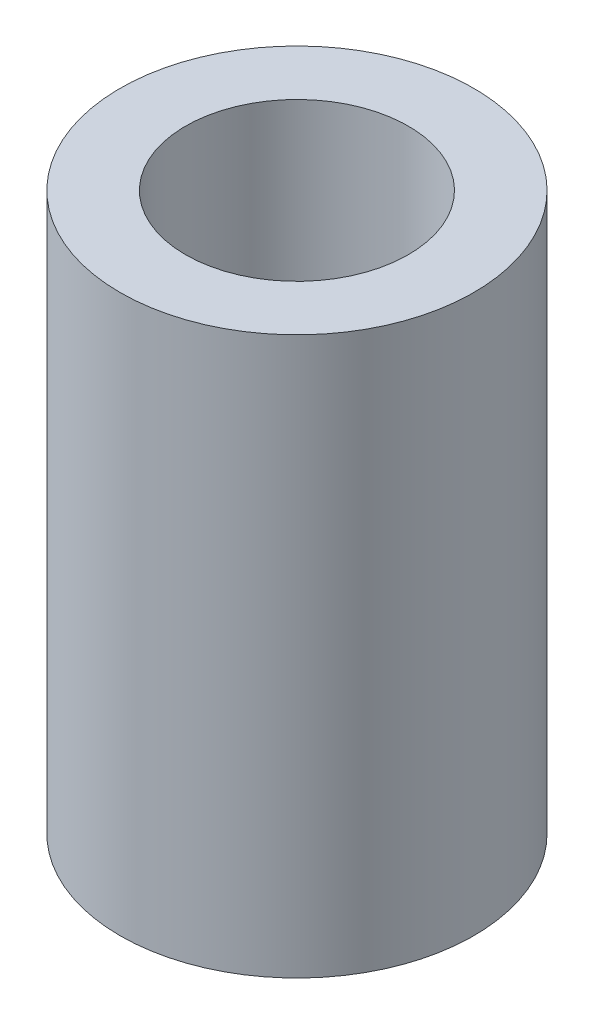
ISO-10303-21;
HEADER;
FILE_DESCRIPTION(('STEP AP214'),'2;1');
FILE_NAME('part.step','',(''),(''),'','','');
FILE_SCHEMA(('AUTOMOTIVE_DESIGN { 1 0 10303 214 1 1 1 1 }'));
ENDSEC;
DATA;
#1=APPLICATION_CONTEXT('core data for automotive mechanical design processes');
#2=APPLICATION_PROTOCOL_DEFINITION('international standard','automotive_design',2000,#1);
#3=PRODUCT_CONTEXT('',#1,'mechanical');
#4=PRODUCT('Part','Part','',(#3));
#5=PRODUCT_RELATED_PRODUCT_CATEGORY('part','',(#4));
#6=PRODUCT_DEFINITION_FORMATION('','',#4);
#7=PRODUCT_DEFINITION_CONTEXT('part definition',#1,'design');
#8=PRODUCT_DEFINITION('design','',#6,#7);
#9=PRODUCT_DEFINITION_SHAPE('','',#8);
#10=(LENGTH_UNIT() NAMED_UNIT(*) SI_UNIT(.MILLI.,.METRE.));
#11=(NAMED_UNIT(*) PLANE_ANGLE_UNIT() SI_UNIT($,.RADIAN.));
#12=(NAMED_UNIT(*) SI_UNIT($,.STERADIAN.) SOLID_ANGLE_UNIT());
#13=UNCERTAINTY_MEASURE_WITH_UNIT(LENGTH_MEASURE(1.E-05),#10,'distance_accuracy_value','');
#14=(GEOMETRIC_REPRESENTATION_CONTEXT(3) GLOBAL_UNCERTAINTY_ASSIGNED_CONTEXT((#13)) GLOBAL_UNIT_ASSIGNED_CONTEXT((#10,
#11,#12)) REPRESENTATION_CONTEXT('',''));
#15=CARTESIAN_POINT('',(0.,0.,0.));
#16=DIRECTION('',(0.,0.,1.));
#17=DIRECTION('',(1.,0.,0.));
#18=AXIS2_PLACEMENT_3D('',#15,#16,#17);
#19=CARTESIAN_POINT('',(0.,15.,0.));
#20=DIRECTION('',(0.,1.,0.));
#21=DIRECTION('',(0.,0.,1.));
#22=AXIS2_PLACEMENT_3D('',#19,#20,#21);
#23=PLANE('',#22);
#24=CARTESIAN_POINT('',(0.,15.,0.));
#25=DIRECTION('',(0.,1.,0.));
#26=DIRECTION('',(0.,0.,1.));
#27=AXIS2_PLACEMENT_3D('',#24,#25,#26);
#28=CIRCLE('',#27,4.7625);
#29=CARTESIAN_POINT('',(0.,15.,4.7625));
#30=VERTEX_POINT('',#29);
#31=EDGE_CURVE('E10',#30,#30,#28,.T.);
#32=ORIENTED_EDGE('',*,*,#31,.T.);
#33=EDGE_LOOP('',(#32));
#34=FACE_BOUND('',#33,.T.);
#35=CARTESIAN_POINT('',(0.,15.,0.));
#36=DIRECTION('',(0.,1.,0.));
#37=DIRECTION('',(0.,0.,1.));
#38=AXIS2_PLACEMENT_3D('',#35,#36,#37);
#39=CIRCLE('',#38,3.);
#40=CARTESIAN_POINT('',(0.,15.,3.));
#41=VERTEX_POINT('',#40);
#42=EDGE_CURVE('E42',#41,#41,#39,.T.);
#43=ORIENTED_EDGE('',*,*,#42,.F.);
#44=EDGE_LOOP('',(#43));
#45=FACE_BOUND('',#44,.T.);
#46=ADVANCED_FACE('F31',(#34,#45),#23,.T.);
#47=CARTESIAN_POINT('',(0.,0.,0.));
#48=DIRECTION('',(0.,1.,0.));
#49=DIRECTION('',(0.,0.,1.));
#50=AXIS2_PLACEMENT_3D('',#47,#48,#49);
#51=PLANE('',#50);
#52=CARTESIAN_POINT('',(0.,0.,0.));
#53=DIRECTION('',(0.,1.,0.));
#54=DIRECTION('',(0.,0.,1.));
#55=AXIS2_PLACEMENT_3D('',#52,#53,#54);
#56=CIRCLE('',#55,4.7625);
#57=CARTESIAN_POINT('',(0.,0.,4.7625));
#58=VERTEX_POINT('',#57);
#59=EDGE_CURVE('E35',#58,#58,#56,.T.);
#60=ORIENTED_EDGE('',*,*,#59,.F.);
#61=EDGE_LOOP('',(#60));
#62=FACE_BOUND('',#61,.T.);
#63=CARTESIAN_POINT('',(0.,0.,0.));
#64=DIRECTION('',(0.,1.,0.));
#65=DIRECTION('',(0.,0.,1.));
#66=AXIS2_PLACEMENT_3D('',#63,#64,#65);
#67=CIRCLE('',#66,3.);
#68=CARTESIAN_POINT('',(0.,0.,3.));
#69=VERTEX_POINT('',#68);
#70=EDGE_CURVE('E44',#69,#69,#67,.T.);
#71=ORIENTED_EDGE('',*,*,#70,.T.);
#72=EDGE_LOOP('',(#71));
#73=FACE_BOUND('',#72,.T.);
#74=ADVANCED_FACE('F54',(#62,#73),#51,.F.);
#75=CARTESIAN_POINT('',(0.,15.,0.));
#76=DIRECTION('',(0.,-1.,0.));
#77=DIRECTION('',(0.,0.,-1.));
#78=AXIS2_PLACEMENT_3D('',#75,#76,#77);
#79=CYLINDRICAL_SURFACE('',#78,4.7625);
#80=ORIENTED_EDGE('',*,*,#31,.F.);
#81=EDGE_LOOP('',(#80));
#82=FACE_BOUND('',#81,.T.);
#83=ORIENTED_EDGE('',*,*,#59,.T.);
#84=EDGE_LOOP('',(#83));
#85=FACE_BOUND('',#84,.T.);
#86=ADVANCED_FACE('F33',(#82,#85),#79,.T.);
#87=CARTESIAN_POINT('',(0.,15.,0.));
#88=DIRECTION('',(0.,-1.,0.));
#89=DIRECTION('',(0.,0.,-1.));
#90=AXIS2_PLACEMENT_3D('',#87,#88,#89);
#91=CYLINDRICAL_SURFACE('',#90,3.);
#92=ORIENTED_EDGE('',*,*,#42,.T.);
#93=EDGE_LOOP('',(#92));
#94=FACE_BOUND('',#93,.T.);
#95=ORIENTED_EDGE('',*,*,#70,.F.);
#96=EDGE_LOOP('',(#95));
#97=FACE_BOUND('',#96,.T.);
#98=ADVANCED_FACE('F50',(#94,#97),#91,.F.);
#99=CLOSED_SHELL('',(#46,#74,#86,#98));
#100=MANIFOLD_SOLID_BREP('B2',#99);
#101=ADVANCED_BREP_SHAPE_REPRESENTATION('',(#18,#100),#14);
#102=SHAPE_DEFINITION_REPRESENTATION(#9,#101);
ENDSEC;
END-ISO-10303-21;
